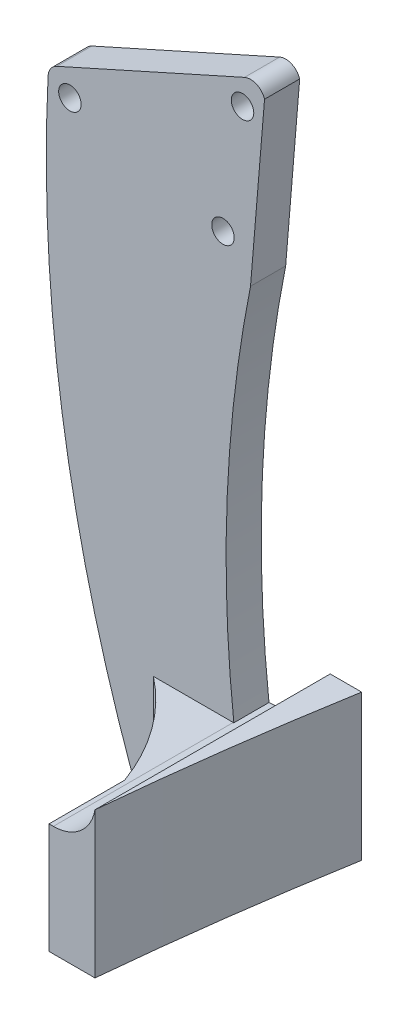
ISO-10303-21;
HEADER;
FILE_DESCRIPTION(('STEP AP214'),'2;1');
FILE_NAME('part.step','',(''),(''),'','','');
FILE_SCHEMA(('AUTOMOTIVE_DESIGN { 1 0 10303 214 1 1 1 1 }'));
ENDSEC;
DATA;
#1=APPLICATION_CONTEXT('core data for automotive mechanical design processes');
#2=APPLICATION_PROTOCOL_DEFINITION('international standard','automotive_design',2000,#1);
#3=PRODUCT_CONTEXT('',#1,'mechanical');
#4=PRODUCT('Part','Part','',(#3));
#5=PRODUCT_RELATED_PRODUCT_CATEGORY('part','',(#4));
#6=PRODUCT_DEFINITION_FORMATION('','',#4);
#7=PRODUCT_DEFINITION_CONTEXT('part definition',#1,'design');
#8=PRODUCT_DEFINITION('design','',#6,#7);
#9=PRODUCT_DEFINITION_SHAPE('','',#8);
#10=(LENGTH_UNIT() NAMED_UNIT(*) SI_UNIT(.MILLI.,.METRE.));
#11=(NAMED_UNIT(*) PLANE_ANGLE_UNIT() SI_UNIT($,.RADIAN.));
#12=(NAMED_UNIT(*) SI_UNIT($,.STERADIAN.) SOLID_ANGLE_UNIT());
#13=UNCERTAINTY_MEASURE_WITH_UNIT(LENGTH_MEASURE(1.E-05),#10,'distance_accuracy_value','');
#14=(GEOMETRIC_REPRESENTATION_CONTEXT(3) GLOBAL_UNCERTAINTY_ASSIGNED_CONTEXT((#13)) GLOBAL_UNIT_ASSIGNED_CONTEXT((#10,
#11,#12)) REPRESENTATION_CONTEXT('',''));
#15=CARTESIAN_POINT('',(0.,0.,0.));
#16=DIRECTION('',(0.,0.,1.));
#17=DIRECTION('',(1.,0.,0.));
#18=AXIS2_PLACEMENT_3D('',#15,#16,#17);
#19=CARTESIAN_POINT('',(16.2572142408426,21.4452040692982,5.));
#20=DIRECTION('',(0.,0.,1.));
#21=DIRECTION('',(1.,0.,0.));
#22=AXIS2_PLACEMENT_3D('',#19,#20,#21);
#23=PLANE('',#22);
#24=CARTESIAN_POINT('',(41.8251543395672,31.6251994580588,5.));
#25=DIRECTION('',(0.,0.,1.));
#26=DIRECTION('',(1.,0.,0.));
#27=AXIS2_PLACEMENT_3D('',#24,#25,#26);
#28=CIRCLE('',#27,1.60000000000001);
#29=CARTESIAN_POINT('',(43.4251543395672,31.6251994580588,5.));
#30=VERTEX_POINT('',#29);
#31=EDGE_CURVE('E247',#30,#30,#28,.T.);
#32=ORIENTED_EDGE('',*,*,#31,.F.);
#33=EDGE_LOOP('',(#32));
#34=FACE_BOUND('',#33,.T.);
#35=CARTESIAN_POINT('',(17.2651543395672,20.3951994580588,5.));
#36=DIRECTION('',(0.,0.,1.));
#37=DIRECTION('',(1.,0.,0.));
#38=AXIS2_PLACEMENT_3D('',#35,#36,#37);
#39=CIRCLE('',#38,1.6);
#40=CARTESIAN_POINT('',(18.8651543395672,20.3951994580588,5.));
#41=VERTEX_POINT('',#40);
#42=EDGE_CURVE('E255',#41,#41,#39,.T.);
#43=ORIENTED_EDGE('',*,*,#42,.F.);
#44=EDGE_LOOP('',(#43));
#45=FACE_BOUND('',#44,.T.);
#46=CARTESIAN_POINT('',(39.0451543395672,14.8551994580588,5.));
#47=DIRECTION('',(0.,0.,1.));
#48=DIRECTION('',(1.,0.,0.));
#49=AXIS2_PLACEMENT_3D('',#46,#47,#48);
#50=CIRCLE('',#49,1.6);
#51=CARTESIAN_POINT('',(40.6451543395672,14.8551994580588,5.));
#52=VERTEX_POINT('',#51);
#53=EDGE_CURVE('E239',#52,#52,#50,.T.);
#54=ORIENTED_EDGE('',*,*,#53,.F.);
#55=EDGE_LOOP('',(#54));
#56=FACE_BOUND('',#55,.T.);
#57=DIRECTION('',(-1.,0.,0.));
#58=VECTOR('',#57,1.);
#59=CARTESIAN_POINT('',(46.4215305001213,-44.9338167263442,5.));
#60=LINE('',#59,#58);
#61=CARTESIAN_POINT('',(40.5054507170217,-44.9338167263442,5.));
#62=VERTEX_POINT('',#61);
#63=CARTESIAN_POINT('',(29.1469550311962,-44.9338167263442,5.));
#64=VERTEX_POINT('',#63);
#65=EDGE_CURVE('E225',#62,#64,#60,.T.);
#66=ORIENTED_EDGE('',*,*,#65,.F.);
#67=CARTESIAN_POINT('',(40.5054507170217,-38.9338167263442,5.));
#68=DIRECTION('',(0.,0.,1.));
#69=DIRECTION('',(1.,0.,0.));
#70=AXIS2_PLACEMENT_3D('',#67,#68,#69);
#71=CIRCLE('',#70,6.);
#72=CARTESIAN_POINT('',(40.5892598780869,-44.9332313665005,5.));
#73=VERTEX_POINT('',#72);
#74=EDGE_CURVE('E350',#62,#73,#71,.T.);
#75=ORIENTED_EDGE('',*,*,#74,.T.);
#76=CARTESIAN_POINT('',(218.611152284186,-25.0784346971441,5.));
#77=DIRECTION('',(0.,0.,-1.));
#78=DIRECTION('',(1.,0.,0.));
#79=AXIS2_PLACEMENT_3D('',#76,#77,#78);
#80=CIRCLE('',#79,179.12567411354);
#81=CARTESIAN_POINT('',(42.9625357268151,10.0437894367557,5.));
#82=VERTEX_POINT('',#81);
#83=EDGE_CURVE('E278',#73,#82,#80,.T.);
#84=ORIENTED_EDGE('',*,*,#83,.T.);
#85=DIRECTION('',(0.0826945492335981,0.996574940246368,0.));
#86=VECTOR('',#85,1.);
#87=CARTESIAN_POINT('',(44.9571998735451,34.0820400985228,5.));
#88=LINE('',#87,#86);
#89=CARTESIAN_POINT('',(44.9571998735451,34.0820400985227,5.));
#90=VERTEX_POINT('',#89);
#91=EDGE_CURVE('E281',#82,#90,#88,.T.);
#92=ORIENTED_EDGE('',*,*,#91,.T.);
#93=CARTESIAN_POINT('',(42.9625357268151,33.4349798734923,5.));
#94=DIRECTION('',(0.,0.,1.));
#95=DIRECTION('',(-1.,0.,0.));
#96=AXIS2_PLACEMENT_3D('',#93,#94,#95);
#97=CIRCLE('',#96,2.09699117620144);
#98=CARTESIAN_POINT('',(42.1036502373313,35.3480109001672,5.));
#99=VERTEX_POINT('',#98);
#100=EDGE_CURVE('E284',#90,#99,#97,.T.);
#101=ORIENTED_EDGE('',*,*,#100,.T.);
#102=DIRECTION('',(-0.912274237672413,-0.40957992538602,0.));
#103=VECTOR('',#102,1.);
#104=CARTESIAN_POINT('',(15.3983287513589,23.3582350959732,5.));
#105=LINE('',#104,#103);
#106=CARTESIAN_POINT('',(15.3983287513589,23.3582350959732,5.));
#107=VERTEX_POINT('',#106);
#108=EDGE_CURVE('E287',#99,#107,#105,.T.);
#109=ORIENTED_EDGE('',*,*,#108,.T.);
#110=CARTESIAN_POINT('',(16.2572142408426,21.4452040692982,5.));
#111=DIRECTION('',(0.,0.,1.));
#112=DIRECTION('',(1.,0.,0.));
#113=AXIS2_PLACEMENT_3D('',#110,#111,#112);
#114=CIRCLE('',#113,2.09699117620142);
#115=CARTESIAN_POINT('',(14.1628027552565,21.5491873473333,5.));
#116=VERTEX_POINT('',#115);
#117=EDGE_CURVE('E263',#107,#116,#114,.T.);
#118=ORIENTED_EDGE('',*,*,#117,.T.);
#119=CARTESIAN_POINT('',(219.398569433382,11.3596482161178,5.));
#120=DIRECTION('',(0.,0.,1.));
#121=DIRECTION('',(1.,0.,0.));
#122=AXIS2_PLACEMENT_3D('',#119,#120,#121);
#123=CIRCLE('',#122,205.48855596277);
#124=CARTESIAN_POINT('',(26.0472913442803,-58.2164244883353,5.));
#125=VERTEX_POINT('',#124);
#126=EDGE_CURVE('E267',#116,#125,#123,.T.);
#127=ORIENTED_EDGE('',*,*,#126,.T.);
#128=CARTESIAN_POINT('',(29.779748648505,-56.8733264579963,5.));
#129=DIRECTION('',(0.,0.,1.));
#130=DIRECTION('',(1.,0.,0.));
#131=AXIS2_PLACEMENT_3D('',#128,#129,#130);
#132=CIRCLE('',#131,3.96675558195376);
#133=CARTESIAN_POINT('',(28.5745746782348,-60.6525731485875,5.));
#134=VERTEX_POINT('',#133);
#135=EDGE_CURVE('E271',#125,#134,#132,.T.);
#136=ORIENTED_EDGE('',*,*,#135,.T.);
#137=DIRECTION('',(1.,0.,0.));
#138=VECTOR('',#137,1.);
#139=CARTESIAN_POINT('',(46.4215305001213,-60.6525731485875,5.));
#140=LINE('',#139,#138);
#141=CARTESIAN_POINT('',(39.8898680711164,-60.6525731485875,5.));
#142=VERTEX_POINT('',#141);
#143=EDGE_CURVE('E274',#134,#142,#140,.T.);
#144=ORIENTED_EDGE('',*,*,#143,.T.);
#145=DIRECTION('',(0.,-1.,0.));
#146=VECTOR('',#145,1.);
#147=CARTESIAN_POINT('',(39.8898680711164,-60.6525731485875,5.));
#148=LINE('',#147,#146);
#149=CARTESIAN_POINT('',(39.8898680711164,-60.6490237112154,5.));
#150=VERTEX_POINT('',#149);
#151=EDGE_CURVE('E175',#150,#142,#148,.T.);
#152=ORIENTED_EDGE('',*,*,#151,.F.);
#153=DIRECTION('',(-1.,0.,0.));
#154=VECTOR('',#153,1.);
#155=CARTESIAN_POINT('',(29.1469550311962,-60.6490237112154,5.));
#156=LINE('',#155,#154);
#157=CARTESIAN_POINT('',(29.1469550311962,-60.6490237112154,5.));
#158=VERTEX_POINT('',#157);
#159=EDGE_CURVE('E425',#150,#158,#156,.T.);
#160=ORIENTED_EDGE('',*,*,#159,.T.);
#161=DIRECTION('',(0.,1.,0.));
#162=VECTOR('',#161,1.);
#163=CARTESIAN_POINT('',(29.1469550311962,-60.6490237112154,5.));
#164=LINE('',#163,#162);
#165=EDGE_CURVE('E422',#158,#64,#164,.T.);
#166=ORIENTED_EDGE('',*,*,#165,.T.);
#167=EDGE_LOOP('',(#66,#75,#84,#92,#101,#109,#118,#127,#136,#144,#152,#160,#166));
#168=FACE_BOUND('',#167,.T.);
#169=ADVANCED_FACE('F43',(#34,#45,#56,#168),#23,.T.);
#170=CARTESIAN_POINT('',(16.2572142408426,21.4452040692982,0.));
#171=DIRECTION('',(0.,0.,1.));
#172=DIRECTION('',(1.,0.,0.));
#173=AXIS2_PLACEMENT_3D('',#170,#171,#172);
#174=PLANE('',#173);
#175=CARTESIAN_POINT('',(16.2572142408426,21.4452040692982,0.));
#176=DIRECTION('',(0.,0.,1.));
#177=DIRECTION('',(1.,0.,0.));
#178=AXIS2_PLACEMENT_3D('',#175,#176,#177);
#179=CIRCLE('',#178,2.09699117620142);
#180=CARTESIAN_POINT('',(15.3983287513589,23.3582350959732,0.));
#181=VERTEX_POINT('',#180);
#182=CARTESIAN_POINT('',(14.1628027552565,21.5491873473333,0.));
#183=VERTEX_POINT('',#182);
#184=EDGE_CURVE('E259',#181,#183,#179,.T.);
#185=ORIENTED_EDGE('',*,*,#184,.F.);
#186=DIRECTION('',(-0.912274237672413,-0.40957992538602,0.));
#187=VECTOR('',#186,1.);
#188=CARTESIAN_POINT('',(15.3983287513589,23.3582350959732,0.));
#189=LINE('',#188,#187);
#190=CARTESIAN_POINT('',(42.1036502373313,35.3480109001672,0.));
#191=VERTEX_POINT('',#190);
#192=EDGE_CURVE('E268',#191,#181,#189,.T.);
#193=ORIENTED_EDGE('',*,*,#192,.F.);
#194=CARTESIAN_POINT('',(42.9625357268151,33.4349798734923,0.));
#195=DIRECTION('',(0.,0.,1.));
#196=DIRECTION('',(-1.,0.,0.));
#197=AXIS2_PLACEMENT_3D('',#194,#195,#196);
#198=CIRCLE('',#197,2.09699117620144);
#199=CARTESIAN_POINT('',(44.9571998735451,34.0820400985227,0.));
#200=VERTEX_POINT('',#199);
#201=EDGE_CURVE('E313',#200,#191,#198,.T.);
#202=ORIENTED_EDGE('',*,*,#201,.F.);
#203=DIRECTION('',(0.0826945492335981,0.996574940246368,0.));
#204=VECTOR('',#203,1.);
#205=CARTESIAN_POINT('',(44.9571998735451,34.0820400985228,0.));
#206=LINE('',#205,#204);
#207=CARTESIAN_POINT('',(42.9625357268151,10.0437894367557,0.));
#208=VERTEX_POINT('',#207);
#209=EDGE_CURVE('E310',#208,#200,#206,.T.);
#210=ORIENTED_EDGE('',*,*,#209,.F.);
#211=CARTESIAN_POINT('',(218.611152284186,-25.0784346971441,0.));
#212=DIRECTION('',(0.,0.,-1.));
#213=DIRECTION('',(1.,0.,0.));
#214=AXIS2_PLACEMENT_3D('',#211,#212,#213);
#215=CIRCLE('',#214,179.12567411354);
#216=CARTESIAN_POINT('',(40.5892598780869,-44.9332313665005,0.));
#217=VERTEX_POINT('',#216);
#218=EDGE_CURVE('E307',#217,#208,#215,.T.);
#219=ORIENTED_EDGE('',*,*,#218,.F.);
#220=CARTESIAN_POINT('',(40.5054507170217,-38.9338167263442,0.));
#221=DIRECTION('',(0.,0.,1.));
#222=DIRECTION('',(1.,0.,0.));
#223=AXIS2_PLACEMENT_3D('',#220,#221,#222);
#224=CIRCLE('',#223,6.);
#225=CARTESIAN_POINT('',(46.4215305001213,-39.9338167263442,0.));
#226=VERTEX_POINT('',#225);
#227=EDGE_CURVE('E53',#217,#226,#224,.T.);
#228=ORIENTED_EDGE('',*,*,#227,.T.);
#229=DIRECTION('',(0.,1.,0.));
#230=VECTOR('',#229,1.);
#231=CARTESIAN_POINT('',(46.4215305001213,-44.9338167263442,0.));
#232=LINE('',#231,#230);
#233=CARTESIAN_POINT('',(46.4215305001213,-60.6525731485875,0.));
#234=VERTEX_POINT('',#233);
#235=EDGE_CURVE('E304',#234,#226,#232,.T.);
#236=ORIENTED_EDGE('',*,*,#235,.F.);
#237=DIRECTION('',(1.,0.,0.));
#238=VECTOR('',#237,1.);
#239=CARTESIAN_POINT('',(46.4215305001213,-60.6525731485875,0.));
#240=LINE('',#239,#238);
#241=CARTESIAN_POINT('',(28.5745746782348,-60.6525731485875,0.));
#242=VERTEX_POINT('',#241);
#243=EDGE_CURVE('E300',#242,#234,#240,.T.);
#244=ORIENTED_EDGE('',*,*,#243,.F.);
#245=CARTESIAN_POINT('',(29.779748648505,-56.8733264579963,0.));
#246=DIRECTION('',(0.,0.,1.));
#247=DIRECTION('',(1.,0.,0.));
#248=AXIS2_PLACEMENT_3D('',#245,#246,#247);
#249=CIRCLE('',#248,3.96675558195376);
#250=CARTESIAN_POINT('',(26.0472913442803,-58.2164244883353,0.));
#251=VERTEX_POINT('',#250);
#252=EDGE_CURVE('E297',#251,#242,#249,.T.);
#253=ORIENTED_EDGE('',*,*,#252,.F.);
#254=CARTESIAN_POINT('',(219.398569433382,11.3596482161178,0.));
#255=DIRECTION('',(0.,0.,1.));
#256=DIRECTION('',(1.,0.,0.));
#257=AXIS2_PLACEMENT_3D('',#254,#255,#256);
#258=CIRCLE('',#257,205.48855596277);
#259=EDGE_CURVE('E294',#183,#251,#258,.T.);
#260=ORIENTED_EDGE('',*,*,#259,.F.);
#261=EDGE_LOOP('',(#185,#193,#202,#210,#219,#228,#236,#244,#253,#260));
#262=FACE_BOUND('',#261,.T.);
#263=CARTESIAN_POINT('',(17.2651543395672,20.3951994580588,0.));
#264=DIRECTION('',(0.,0.,1.));
#265=DIRECTION('',(1.,0.,0.));
#266=AXIS2_PLACEMENT_3D('',#263,#264,#265);
#267=CIRCLE('',#266,1.6);
#268=CARTESIAN_POINT('',(18.8651543395672,20.3951994580588,0.));
#269=VERTEX_POINT('',#268);
#270=EDGE_CURVE('E251',#269,#269,#267,.T.);
#271=ORIENTED_EDGE('',*,*,#270,.T.);
#272=EDGE_LOOP('',(#271));
#273=FACE_BOUND('',#272,.T.);
#274=CARTESIAN_POINT('',(41.8251543395672,31.6251994580588,0.));
#275=DIRECTION('',(0.,0.,1.));
#276=DIRECTION('',(1.,0.,0.));
#277=AXIS2_PLACEMENT_3D('',#274,#275,#276);
#278=CIRCLE('',#277,1.60000000000001);
#279=CARTESIAN_POINT('',(43.4251543395672,31.6251994580588,0.));
#280=VERTEX_POINT('',#279);
#281=EDGE_CURVE('E243',#280,#280,#278,.T.);
#282=ORIENTED_EDGE('',*,*,#281,.T.);
#283=EDGE_LOOP('',(#282));
#284=FACE_BOUND('',#283,.T.);
#285=CARTESIAN_POINT('',(39.0451543395672,14.8551994580588,0.));
#286=DIRECTION('',(0.,0.,1.));
#287=DIRECTION('',(1.,0.,0.));
#288=AXIS2_PLACEMENT_3D('',#285,#286,#287);
#289=CIRCLE('',#288,1.6);
#290=CARTESIAN_POINT('',(40.6451543395672,14.8551994580588,0.));
#291=VERTEX_POINT('',#290);
#292=EDGE_CURVE('E238',#291,#291,#289,.T.);
#293=ORIENTED_EDGE('',*,*,#292,.T.);
#294=EDGE_LOOP('',(#293));
#295=FACE_BOUND('',#294,.T.);
#296=ADVANCED_FACE('F359',(#262,#273,#284,#295),#174,.F.);
#297=CARTESIAN_POINT('',(16.2572142408426,21.4452040692982,5.));
#298=DIRECTION('',(0.,0.,-1.));
#299=DIRECTION('',(-1.,0.,0.));
#300=AXIS2_PLACEMENT_3D('',#297,#298,#299);
#301=CYLINDRICAL_SURFACE('',#300,2.09699117620142);
#302=ORIENTED_EDGE('',*,*,#184,.T.);
#303=DIRECTION('',(0.,0.,-1.));
#304=VECTOR('',#303,1.);
#305=CARTESIAN_POINT('',(14.1628027552565,21.5491873473333,5.));
#306=LINE('',#305,#304);
#307=EDGE_CURVE('E229',#116,#183,#306,.T.);
#308=ORIENTED_EDGE('',*,*,#307,.F.);
#309=ORIENTED_EDGE('',*,*,#117,.F.);
#310=DIRECTION('',(0.,0.,-1.));
#311=VECTOR('',#310,1.);
#312=CARTESIAN_POINT('',(15.3983287513589,23.3582350959732,5.));
#313=LINE('',#312,#311);
#314=EDGE_CURVE('E290',#107,#181,#313,.T.);
#315=ORIENTED_EDGE('',*,*,#314,.T.);
#316=EDGE_LOOP('',(#302,#308,#309,#315));
#317=FACE_BOUND('',#316,.T.);
#318=ADVANCED_FACE('F402',(#317),#301,.T.);
#319=CARTESIAN_POINT('',(219.398569433382,11.3596482161178,5.));
#320=DIRECTION('',(0.,0.,-1.));
#321=DIRECTION('',(-1.,0.,0.));
#322=AXIS2_PLACEMENT_3D('',#319,#320,#321);
#323=CYLINDRICAL_SURFACE('',#322,205.48855596277);
#324=ORIENTED_EDGE('',*,*,#259,.T.);
#325=DIRECTION('',(0.,0.,-1.));
#326=VECTOR('',#325,1.);
#327=CARTESIAN_POINT('',(26.0472913442803,-58.2164244883353,5.));
#328=LINE('',#327,#326);
#329=EDGE_CURVE('E340',#125,#251,#328,.T.);
#330=ORIENTED_EDGE('',*,*,#329,.F.);
#331=ORIENTED_EDGE('',*,*,#126,.F.);
#332=ORIENTED_EDGE('',*,*,#307,.T.);
#333=EDGE_LOOP('',(#324,#330,#331,#332));
#334=FACE_BOUND('',#333,.T.);
#335=ADVANCED_FACE('F398',(#334),#323,.T.);
#336=CARTESIAN_POINT('',(29.779748648505,-56.8733264579963,5.));
#337=DIRECTION('',(0.,0.,-1.));
#338=DIRECTION('',(-1.,0.,0.));
#339=AXIS2_PLACEMENT_3D('',#336,#337,#338);
#340=CYLINDRICAL_SURFACE('',#339,3.96675558195376);
#341=ORIENTED_EDGE('',*,*,#252,.T.);
#342=DIRECTION('',(0.,0.,-1.));
#343=VECTOR('',#342,1.);
#344=CARTESIAN_POINT('',(28.5745746782348,-60.6525731485875,5.));
#345=LINE('',#344,#343);
#346=EDGE_CURVE('E336',#134,#242,#345,.T.);
#347=ORIENTED_EDGE('',*,*,#346,.F.);
#348=ORIENTED_EDGE('',*,*,#135,.F.);
#349=ORIENTED_EDGE('',*,*,#329,.T.);
#350=EDGE_LOOP('',(#341,#347,#348,#349));
#351=FACE_BOUND('',#350,.T.);
#352=ADVANCED_FACE('F394',(#351),#340,.T.);
#353=CARTESIAN_POINT('',(46.4215305001213,-60.6525731485875,5.));
#354=DIRECTION('',(0.,1.,0.));
#355=DIRECTION('',(-1.,0.,0.));
#356=AXIS2_PLACEMENT_3D('',#353,#354,#355);
#357=PLANE('',#356);
#358=ORIENTED_EDGE('',*,*,#243,.T.);
#359=DIRECTION('',(0.,0.,-1.));
#360=VECTOR('',#359,1.);
#361=CARTESIAN_POINT('',(46.4215305001213,-60.6525731485875,5.));
#362=LINE('',#361,#360);
#363=CARTESIAN_POINT('',(46.4215305001213,-60.6525731485875,30.5949893879026));
#364=VERTEX_POINT('',#363);
#365=EDGE_CURVE('E333',#364,#234,#362,.T.);
#366=ORIENTED_EDGE('',*,*,#365,.F.);
#367=DIRECTION('',(1.,0.,0.));
#368=VECTOR('',#367,1.);
#369=CARTESIAN_POINT('',(46.4215305001213,-60.6525731485875,30.5949893879026));
#370=LINE('',#369,#368);
#371=CARTESIAN_POINT('',(39.8898680711164,-60.6525731485875,30.5949893879026));
#372=VERTEX_POINT('',#371);
#373=EDGE_CURVE('E220',#372,#364,#370,.T.);
#374=ORIENTED_EDGE('',*,*,#373,.F.);
#375=DIRECTION('',(0.,0.,-1.));
#376=VECTOR('',#375,1.);
#377=CARTESIAN_POINT('',(39.8898680711164,-60.6525731485875,30.5949893879026));
#378=LINE('',#377,#376);
#379=EDGE_CURVE('E224',#372,#142,#378,.T.);
#380=ORIENTED_EDGE('',*,*,#379,.T.);
#381=ORIENTED_EDGE('',*,*,#143,.F.);
#382=ORIENTED_EDGE('',*,*,#346,.T.);
#383=EDGE_LOOP('',(#358,#366,#374,#380,#381,#382));
#384=FACE_BOUND('',#383,.T.);
#385=ADVANCED_FACE('F389',(#384),#357,.F.);
#386=CARTESIAN_POINT('',(40.589325164294,-44.9338167263442,5.));
#387=DIRECTION('',(0.,-1.,0.));
#388=DIRECTION('',(0.,0.,-1.));
#389=AXIS2_PLACEMENT_3D('',#386,#387,#388);
#390=PLANE('',#389);
#391=DIRECTION('',(-1.,0.,0.));
#392=VECTOR('',#391,1.);
#393=CARTESIAN_POINT('',(46.4215305001213,-44.9338167263442,30.5949893879026));
#394=LINE('',#393,#392);
#395=CARTESIAN_POINT('',(40.5054507170217,-44.9338167263442,30.5949893879026));
#396=VERTEX_POINT('',#395);
#397=CARTESIAN_POINT('',(39.8898680711164,-44.9338167263442,30.5949893879026));
#398=VERTEX_POINT('',#397);
#399=EDGE_CURVE('E214',#396,#398,#394,.T.);
#400=ORIENTED_EDGE('',*,*,#399,.F.);
#401=DIRECTION('',(0.,0.,1.));
#402=VECTOR('',#401,1.);
#403=CARTESIAN_POINT('',(40.5054507170217,-44.9338167263442,5.));
#404=LINE('',#403,#402);
#405=EDGE_CURVE('E228',#396,#62,#404,.F.);
#406=ORIENTED_EDGE('',*,*,#405,.T.);
#407=ORIENTED_EDGE('',*,*,#65,.T.);
#408=CARTESIAN_POINT('',(8.69418947591122,-44.9338167263442,31.1128431833534));
#409=DIRECTION('',(0.,-1.,0.));
#410=DIRECTION('',(0.,0.,1.));
#411=AXIS2_PLACEMENT_3D('',#408,#409,#410);
#412=CIRCLE('',#411,33.1692055674817);
#413=CARTESIAN_POINT('',(39.8898680711164,-44.9338167263442,19.8422693309485));
#414=VERTEX_POINT('',#413);
#415=EDGE_CURVE('E382',#64,#414,#412,.T.);
#416=ORIENTED_EDGE('',*,*,#415,.T.);
#417=DIRECTION('',(0.,0.,-1.));
#418=VECTOR('',#417,1.);
#419=CARTESIAN_POINT('',(39.8898680711164,-44.9338167263442,30.5949893879026));
#420=LINE('',#419,#418);
#421=EDGE_CURVE('E235',#398,#414,#420,.T.);
#422=ORIENTED_EDGE('',*,*,#421,.F.);
#423=EDGE_LOOP('',(#400,#406,#407,#416,#422));
#424=FACE_BOUND('',#423,.T.);
#425=ADVANCED_FACE('F377',(#424),#390,.F.);
#426=CARTESIAN_POINT('',(218.611152284186,-25.0784346971441,5.));
#427=DIRECTION('',(0.,0.,-1.));
#428=DIRECTION('',(-1.,0.,0.));
#429=AXIS2_PLACEMENT_3D('',#426,#427,#428);
#430=CYLINDRICAL_SURFACE('',#429,179.12567411354);
#431=ORIENTED_EDGE('',*,*,#83,.F.);
#432=DIRECTION('',(0.,0.,-1.));
#433=VECTOR('',#432,1.);
#434=CARTESIAN_POINT('',(40.5892598780869,-44.9332313665005,5.));
#435=LINE('',#434,#433);
#436=EDGE_CURVE('E60',#73,#217,#435,.T.);
#437=ORIENTED_EDGE('',*,*,#436,.T.);
#438=ORIENTED_EDGE('',*,*,#218,.T.);
#439=DIRECTION('',(0.,0.,-1.));
#440=VECTOR('',#439,1.);
#441=CARTESIAN_POINT('',(42.9625357268151,10.0437894367557,5.));
#442=LINE('',#441,#440);
#443=EDGE_CURVE('E329',#82,#208,#442,.T.);
#444=ORIENTED_EDGE('',*,*,#443,.F.);
#445=EDGE_LOOP('',(#431,#437,#438,#444));
#446=FACE_BOUND('',#445,.T.);
#447=ADVANCED_FACE('F418',(#446),#430,.F.);
#448=CARTESIAN_POINT('',(44.9571998735451,34.0820400985228,5.));
#449=DIRECTION('',(-0.996574940246368,0.0826945492335981,0.));
#450=DIRECTION('',(-0.0826945492335982,-0.996574940246368,0.));
#451=AXIS2_PLACEMENT_3D('',#448,#449,#450);
#452=PLANE('',#451);
#453=ORIENTED_EDGE('',*,*,#209,.T.);
#454=DIRECTION('',(0.,0.,-1.));
#455=VECTOR('',#454,1.);
#456=CARTESIAN_POINT('',(44.9571998735451,34.0820400985227,5.));
#457=LINE('',#456,#455);
#458=EDGE_CURVE('E325',#90,#200,#457,.T.);
#459=ORIENTED_EDGE('',*,*,#458,.F.);
#460=ORIENTED_EDGE('',*,*,#91,.F.);
#461=ORIENTED_EDGE('',*,*,#443,.T.);
#462=EDGE_LOOP('',(#453,#459,#460,#461));
#463=FACE_BOUND('',#462,.T.);
#464=ADVANCED_FACE('F416',(#463),#452,.F.);
#465=CARTESIAN_POINT('',(42.9625357268151,33.4349798734923,5.));
#466=DIRECTION('',(0.,0.,-1.));
#467=DIRECTION('',(-1.,0.,0.));
#468=AXIS2_PLACEMENT_3D('',#465,#466,#467);
#469=CYLINDRICAL_SURFACE('',#468,2.09699117620144);
#470=ORIENTED_EDGE('',*,*,#201,.T.);
#471=DIRECTION('',(0.,0.,-1.));
#472=VECTOR('',#471,1.);
#473=CARTESIAN_POINT('',(42.1036502373313,35.3480109001672,5.));
#474=LINE('',#473,#472);
#475=EDGE_CURVE('E321',#99,#191,#474,.T.);
#476=ORIENTED_EDGE('',*,*,#475,.F.);
#477=ORIENTED_EDGE('',*,*,#100,.F.);
#478=ORIENTED_EDGE('',*,*,#458,.T.);
#479=EDGE_LOOP('',(#470,#476,#477,#478));
#480=FACE_BOUND('',#479,.T.);
#481=ADVANCED_FACE('F412',(#480),#469,.T.);
#482=CARTESIAN_POINT('',(15.3983287513589,23.3582350959732,5.));
#483=DIRECTION('',(0.40957992538602,-0.912274237672413,0.));
#484=DIRECTION('',(0.912274237672413,0.40957992538602,0.));
#485=AXIS2_PLACEMENT_3D('',#482,#483,#484);
#486=PLANE('',#485);
#487=ORIENTED_EDGE('',*,*,#192,.T.);
#488=ORIENTED_EDGE('',*,*,#314,.F.);
#489=ORIENTED_EDGE('',*,*,#108,.F.);
#490=ORIENTED_EDGE('',*,*,#475,.T.);
#491=EDGE_LOOP('',(#487,#488,#489,#490));
#492=FACE_BOUND('',#491,.T.);
#493=ADVANCED_FACE('F407',(#492),#486,.F.);
#494=CARTESIAN_POINT('',(17.2651543395672,20.3951994580588,5.));
#495=DIRECTION('',(0.,0.,-1.));
#496=DIRECTION('',(-1.,0.,0.));
#497=AXIS2_PLACEMENT_3D('',#494,#495,#496);
#498=CYLINDRICAL_SURFACE('',#497,1.6);
#499=ORIENTED_EDGE('',*,*,#42,.T.);
#500=EDGE_LOOP('',(#499));
#501=FACE_BOUND('',#500,.T.);
#502=ORIENTED_EDGE('',*,*,#270,.F.);
#503=EDGE_LOOP('',(#502));
#504=FACE_BOUND('',#503,.T.);
#505=ADVANCED_FACE('F463',(#501,#504),#498,.F.);
#506=CARTESIAN_POINT('',(41.8251543395672,31.6251994580588,5.));
#507=DIRECTION('',(0.,0.,-1.));
#508=DIRECTION('',(-1.,0.,0.));
#509=AXIS2_PLACEMENT_3D('',#506,#507,#508);
#510=CYLINDRICAL_SURFACE('',#509,1.60000000000001);
#511=ORIENTED_EDGE('',*,*,#31,.T.);
#512=EDGE_LOOP('',(#511));
#513=FACE_BOUND('',#512,.T.);
#514=ORIENTED_EDGE('',*,*,#281,.F.);
#515=EDGE_LOOP('',(#514));
#516=FACE_BOUND('',#515,.T.);
#517=ADVANCED_FACE('F527',(#513,#516),#510,.F.);
#518=CARTESIAN_POINT('',(39.0451543395672,14.8551994580588,5.));
#519=DIRECTION('',(0.,0.,-1.));
#520=DIRECTION('',(-1.,0.,0.));
#521=AXIS2_PLACEMENT_3D('',#518,#519,#520);
#522=CYLINDRICAL_SURFACE('',#521,1.6);
#523=ORIENTED_EDGE('',*,*,#53,.T.);
#524=EDGE_LOOP('',(#523));
#525=FACE_BOUND('',#524,.T.);
#526=ORIENTED_EDGE('',*,*,#292,.F.);
#527=EDGE_LOOP('',(#526));
#528=FACE_BOUND('',#527,.T.);
#529=ADVANCED_FACE('F534',(#525,#528),#522,.F.);
#530=CARTESIAN_POINT('',(39.8898680711164,-60.6525731485875,30.5949893879026));
#531=DIRECTION('',(1.,0.,0.));
#532=DIRECTION('',(0.,0.,-1.));
#533=AXIS2_PLACEMENT_3D('',#530,#531,#532);
#534=PLANE('',#533);
#535=ORIENTED_EDGE('',*,*,#421,.T.);
#536=DIRECTION('',(0.,1.,0.));
#537=VECTOR('',#536,1.);
#538=CARTESIAN_POINT('',(39.8898680711164,-60.6490237112154,19.8422693309485));
#539=LINE('',#538,#537);
#540=CARTESIAN_POINT('',(39.8898680711164,-60.6490237112154,19.8422693309485));
#541=VERTEX_POINT('',#540);
#542=EDGE_CURVE('E187',#414,#541,#539,.F.);
#543=ORIENTED_EDGE('',*,*,#542,.T.);
#544=DIRECTION('',(0.,0.,1.));
#545=VECTOR('',#544,1.);
#546=CARTESIAN_POINT('',(39.8898680711164,-60.6490237112154,30.5949893879026));
#547=LINE('',#546,#545);
#548=EDGE_CURVE('E430',#150,#541,#547,.T.);
#549=ORIENTED_EDGE('',*,*,#548,.F.);
#550=ORIENTED_EDGE('',*,*,#151,.T.);
#551=ORIENTED_EDGE('',*,*,#379,.F.);
#552=DIRECTION('',(0.,-1.,0.));
#553=VECTOR('',#552,1.);
#554=CARTESIAN_POINT('',(39.8898680711164,-60.6525731485875,30.5949893879026));
#555=LINE('',#554,#553);
#556=EDGE_CURVE('E217',#398,#372,#555,.T.);
#557=ORIENTED_EDGE('',*,*,#556,.F.);
#558=EDGE_LOOP('',(#535,#543,#549,#550,#551,#557));
#559=FACE_BOUND('',#558,.T.);
#560=ADVANCED_FACE('F386',(#559),#534,.F.);
#561=CARTESIAN_POINT('',(0.,0.,30.5949893879026));
#562=DIRECTION('',(0.,0.,1.));
#563=DIRECTION('',(1.,0.,0.));
#564=AXIS2_PLACEMENT_3D('',#561,#562,#563);
#565=PLANE('',#564);
#566=DIRECTION('',(0.,1.,0.));
#567=VECTOR('',#566,1.);
#568=CARTESIAN_POINT('',(46.4215305001213,-60.6525731485875,30.5949893879026));
#569=LINE('',#568,#567);
#570=CARTESIAN_POINT('',(46.4215305001213,-39.9338167263442,30.5949893879026));
#571=VERTEX_POINT('',#570);
#572=EDGE_CURVE('E171',#364,#571,#569,.T.);
#573=ORIENTED_EDGE('',*,*,#572,.T.);
#574=CARTESIAN_POINT('',(40.5054507170217,-38.9338167263442,30.5949893879026));
#575=DIRECTION('',(0.,0.,1.));
#576=DIRECTION('',(1.,0.,0.));
#577=AXIS2_PLACEMENT_3D('',#574,#575,#576);
#578=CIRCLE('',#577,6.);
#579=EDGE_CURVE('E11',#571,#396,#578,.F.);
#580=ORIENTED_EDGE('',*,*,#579,.T.);
#581=ORIENTED_EDGE('',*,*,#399,.T.);
#582=ORIENTED_EDGE('',*,*,#556,.T.);
#583=ORIENTED_EDGE('',*,*,#373,.T.);
#584=EDGE_LOOP('',(#573,#580,#581,#582,#583));
#585=FACE_BOUND('',#584,.T.);
#586=ADVANCED_FACE('F374',(#585),#565,.T.);
#587=CARTESIAN_POINT('',(46.4215305001213,-39.9338167263442,30.5949893879026));
#588=DIRECTION('',(1.,0.,0.));
#589=DIRECTION('',(0.,0.,-1.));
#590=AXIS2_PLACEMENT_3D('',#587,#588,#589);
#591=PLANE('',#590);
#592=ORIENTED_EDGE('',*,*,#235,.T.);
#593=DIRECTION('',(0.,0.,1.));
#594=VECTOR('',#593,1.);
#595=CARTESIAN_POINT('',(46.4215305001213,-39.9338167263442,0.));
#596=LINE('',#595,#594);
#597=CARTESIAN_POINT('',(46.4215305001213,-39.9338167263442,-2.87960559810814));
#598=VERTEX_POINT('',#597);
#599=EDGE_CURVE('E198',#598,#226,#596,.T.);
#600=ORIENTED_EDGE('',*,*,#599,.F.);
#601=DIRECTION('',(0.,-1.,0.));
#602=VECTOR('',#601,1.);
#603=CARTESIAN_POINT('',(46.4215305001213,-39.9338167263442,-2.87960559810814));
#604=LINE('',#603,#602);
#605=CARTESIAN_POINT('',(46.4215305001213,-60.6591363230863,-2.87960559810814));
#606=VERTEX_POINT('',#605);
#607=EDGE_CURVE('E183',#598,#606,#604,.T.);
#608=ORIENTED_EDGE('',*,*,#607,.T.);
#609=DIRECTION('',(0.,0.,1.));
#610=VECTOR('',#609,1.);
#611=CARTESIAN_POINT('',(46.4215305001213,-60.6591363230863,0.));
#612=LINE('',#611,#610);
#613=CARTESIAN_POINT('',(46.4215305001213,-60.6591363230863,30.5949893879026));
#614=VERTEX_POINT('',#613);
#615=EDGE_CURVE('E179',#606,#614,#612,.T.);
#616=ORIENTED_EDGE('',*,*,#615,.T.);
#617=DIRECTION('',(0.,-1.,0.));
#618=VECTOR('',#617,1.);
#619=CARTESIAN_POINT('',(46.4215305001213,-39.9338167263442,30.5949893879026));
#620=LINE('',#619,#618);
#621=EDGE_CURVE('E162',#364,#614,#620,.T.);
#622=ORIENTED_EDGE('',*,*,#621,.F.);
#623=ORIENTED_EDGE('',*,*,#365,.T.);
#624=EDGE_LOOP('',(#592,#600,#608,#616,#622,#623));
#625=FACE_BOUND('',#624,.T.);
#626=ADVANCED_FACE('F180',(#625),#591,.F.);
#627=CARTESIAN_POINT('',(493.305440785711,-39.9338167263442,73.2678988097807));
#628=DIRECTION('',(0.,-1.,0.));
#629=DIRECTION('',(0.,0.,-1.));
#630=AXIS2_PLACEMENT_3D('',#627,#628,#629);
#631=CYLINDRICAL_SURFACE('',#630,448.916703265391);
#632=CARTESIAN_POINT('',(493.305440785711,-39.9338167263442,73.2678988097807));
#633=DIRECTION('',(0.,-1.,0.));
#634=DIRECTION('',(0.,0.,1.));
#635=AXIS2_PLACEMENT_3D('',#632,#633,#634);
#636=CIRCLE('',#635,448.916703265391);
#637=CARTESIAN_POINT('',(50.8941343715131,-39.9338167263442,-2.87960559810824));
#638=VERTEX_POINT('',#637);
#639=EDGE_CURVE('E202',#571,#638,#636,.T.);
#640=ORIENTED_EDGE('',*,*,#639,.F.);
#641=ORIENTED_EDGE('',*,*,#572,.F.);
#642=ORIENTED_EDGE('',*,*,#621,.T.);
#643=CARTESIAN_POINT('',(493.305440785711,-60.6591363230863,73.2678988097807));
#644=DIRECTION('',(0.,-1.,0.));
#645=DIRECTION('',(0.,0.,1.));
#646=AXIS2_PLACEMENT_3D('',#643,#644,#645);
#647=CIRCLE('',#646,448.916703265391);
#648=CARTESIAN_POINT('',(50.8941343715131,-60.6591363230863,-2.87960559810824));
#649=VERTEX_POINT('',#648);
#650=EDGE_CURVE('E168',#614,#649,#647,.T.);
#651=ORIENTED_EDGE('',*,*,#650,.T.);
#652=DIRECTION('',(0.,-1.,0.));
#653=VECTOR('',#652,1.);
#654=CARTESIAN_POINT('',(50.8941343715131,-39.9338167263442,-2.87960559810824));
#655=LINE('',#654,#653);
#656=EDGE_CURVE('E176',#638,#649,#655,.T.);
#657=ORIENTED_EDGE('',*,*,#656,.F.);
#658=EDGE_LOOP('',(#640,#641,#642,#651,#657));
#659=FACE_BOUND('',#658,.T.);
#660=ADVANCED_FACE('F165',(#659),#631,.F.);
#661=CARTESIAN_POINT('',(46.4215305001213,-39.9338167263442,-2.87960559810814));
#662=DIRECTION('',(0.,0.,1.));
#663=DIRECTION('',(1.,0.,0.));
#664=AXIS2_PLACEMENT_3D('',#661,#662,#663);
#665=PLANE('',#664);
#666=ORIENTED_EDGE('',*,*,#656,.T.);
#667=DIRECTION('',(-1.,0.,0.));
#668=VECTOR('',#667,1.);
#669=CARTESIAN_POINT('',(46.4215305001213,-60.6591363230863,-2.87960559810814));
#670=LINE('',#669,#668);
#671=EDGE_CURVE('E190',#649,#606,#670,.T.);
#672=ORIENTED_EDGE('',*,*,#671,.T.);
#673=ORIENTED_EDGE('',*,*,#607,.F.);
#674=DIRECTION('',(-1.,0.,0.));
#675=VECTOR('',#674,1.);
#676=CARTESIAN_POINT('',(46.4215305001213,-39.9338167263442,-2.87960559810814));
#677=LINE('',#676,#675);
#678=EDGE_CURVE('E205',#638,#598,#677,.T.);
#679=ORIENTED_EDGE('',*,*,#678,.F.);
#680=EDGE_LOOP('',(#666,#672,#673,#679));
#681=FACE_BOUND('',#680,.T.);
#682=ADVANCED_FACE('F566',(#681),#665,.F.);
#683=CARTESIAN_POINT('',(493.305440785711,-39.9338167263442,73.2678988097807));
#684=DIRECTION('',(0.,1.,0.));
#685=DIRECTION('',(0.,0.,1.));
#686=AXIS2_PLACEMENT_3D('',#683,#684,#685);
#687=PLANE('',#686);
#688=ORIENTED_EDGE('',*,*,#599,.T.);
#689=EDGE_CURVE('E194',#226,#571,#596,.T.);
#690=ORIENTED_EDGE('',*,*,#689,.T.);
#691=ORIENTED_EDGE('',*,*,#639,.T.);
#692=ORIENTED_EDGE('',*,*,#678,.T.);
#693=EDGE_LOOP('',(#688,#690,#691,#692));
#694=FACE_BOUND('',#693,.T.);
#695=ADVANCED_FACE('F367',(#694),#687,.T.);
#696=CARTESIAN_POINT('',(493.305440785711,-60.6591363230863,73.2678988097807));
#697=DIRECTION('',(0.,1.,0.));
#698=DIRECTION('',(0.,0.,1.));
#699=AXIS2_PLACEMENT_3D('',#696,#697,#698);
#700=PLANE('',#699);
#701=ORIENTED_EDGE('',*,*,#615,.F.);
#702=ORIENTED_EDGE('',*,*,#671,.F.);
#703=ORIENTED_EDGE('',*,*,#650,.F.);
#704=EDGE_LOOP('',(#701,#702,#703));
#705=FACE_BOUND('',#704,.T.);
#706=ADVANCED_FACE('F189',(#705),#700,.F.);
#707=CARTESIAN_POINT('',(8.69418947591122,-60.6490237112154,31.1128431833534));
#708=DIRECTION('',(0.,1.,0.));
#709=DIRECTION('',(0.,0.,1.));
#710=AXIS2_PLACEMENT_3D('',#707,#708,#709);
#711=CYLINDRICAL_SURFACE('',#710,33.1692055674817);
#712=ORIENTED_EDGE('',*,*,#542,.F.);
#713=ORIENTED_EDGE('',*,*,#415,.F.);
#714=ORIENTED_EDGE('',*,*,#165,.F.);
#715=CARTESIAN_POINT('',(8.69418947591122,-60.6490237112154,31.1128431833534));
#716=DIRECTION('',(0.,-1.,0.));
#717=DIRECTION('',(0.,0.,1.));
#718=AXIS2_PLACEMENT_3D('',#715,#716,#717);
#719=CIRCLE('',#718,33.1692055674817);
#720=EDGE_CURVE('E434',#158,#541,#719,.T.);
#721=ORIENTED_EDGE('',*,*,#720,.T.);
#722=EDGE_LOOP('',(#712,#713,#714,#721));
#723=FACE_BOUND('',#722,.T.);
#724=ADVANCED_FACE('F432',(#723),#711,.F.);
#725=CARTESIAN_POINT('',(8.69418947591122,-60.6490237112154,31.1128431833534));
#726=DIRECTION('',(0.,1.,0.));
#727=DIRECTION('',(0.,0.,1.));
#728=AXIS2_PLACEMENT_3D('',#725,#726,#727);
#729=PLANE('',#728);
#730=ORIENTED_EDGE('',*,*,#159,.F.);
#731=ORIENTED_EDGE('',*,*,#548,.T.);
#732=ORIENTED_EDGE('',*,*,#720,.F.);
#733=EDGE_LOOP('',(#730,#731,#732));
#734=FACE_BOUND('',#733,.T.);
#735=ADVANCED_FACE('F444',(#734),#729,.F.);
#736=CARTESIAN_POINT('',(40.5054507170217,-38.9338167263442,30.5949893879026));
#737=DIRECTION('',(0.,0.,1.));
#738=DIRECTION('',(1.,0.,0.));
#739=AXIS2_PLACEMENT_3D('',#736,#737,#738);
#740=CYLINDRICAL_SURFACE('',#739,6.);
#741=ORIENTED_EDGE('',*,*,#579,.F.);
#742=ORIENTED_EDGE('',*,*,#689,.F.);
#743=ORIENTED_EDGE('',*,*,#227,.F.);
#744=ORIENTED_EDGE('',*,*,#436,.F.);
#745=ORIENTED_EDGE('',*,*,#74,.F.);
#746=ORIENTED_EDGE('',*,*,#405,.F.);
#747=EDGE_LOOP('',(#741,#742,#743,#744,#745,#746));
#748=FACE_BOUND('',#747,.T.);
#749=ADVANCED_FACE('F45',(#748),#740,.F.);
#750=CLOSED_SHELL('',(#169,#296,#318,#335,#352,#385,#425,#447,#464,#481,#493,#505,#517,#529,
#560,#586,#626,#660,#682,#695,#706,#724,#735,#749));
#751=MANIFOLD_SOLID_BREP('B2',#750);
#752=ADVANCED_BREP_SHAPE_REPRESENTATION('',(#18,#751),#14);
#753=SHAPE_DEFINITION_REPRESENTATION(#9,#752);
ENDSEC;
END-ISO-10303-21;
